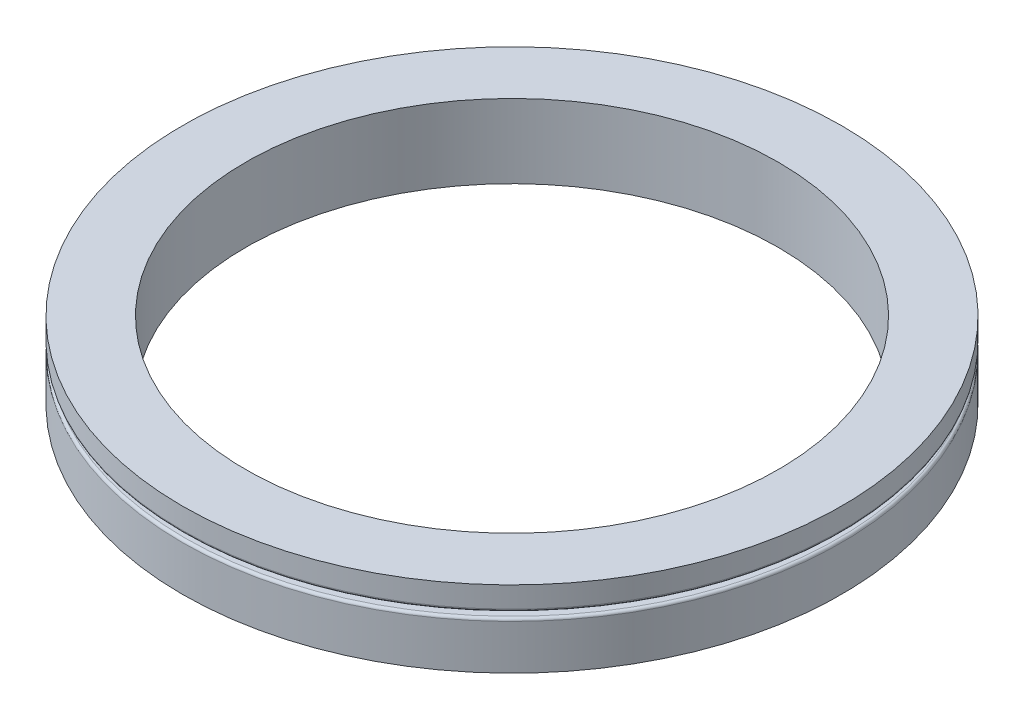
ISO-10303-21;
HEADER;
FILE_DESCRIPTION(('STEP AP214'),'2;1');
FILE_NAME('part.step','',(''),(''),'','','');
FILE_SCHEMA(('AUTOMOTIVE_DESIGN { 1 0 10303 214 1 1 1 1 }'));
ENDSEC;
DATA;
#1=APPLICATION_CONTEXT('core data for automotive mechanical design processes');
#2=APPLICATION_PROTOCOL_DEFINITION('international standard','automotive_design',2000,#1);
#3=PRODUCT_CONTEXT('',#1,'mechanical');
#4=PRODUCT('Part','Part','',(#3));
#5=PRODUCT_RELATED_PRODUCT_CATEGORY('part','',(#4));
#6=PRODUCT_DEFINITION_FORMATION('','',#4);
#7=PRODUCT_DEFINITION_CONTEXT('part definition',#1,'design');
#8=PRODUCT_DEFINITION('design','',#6,#7);
#9=PRODUCT_DEFINITION_SHAPE('','',#8);
#10=(LENGTH_UNIT() NAMED_UNIT(*) SI_UNIT(.MILLI.,.METRE.));
#11=(NAMED_UNIT(*) PLANE_ANGLE_UNIT() SI_UNIT($,.RADIAN.));
#12=(NAMED_UNIT(*) SI_UNIT($,.STERADIAN.) SOLID_ANGLE_UNIT());
#13=UNCERTAINTY_MEASURE_WITH_UNIT(LENGTH_MEASURE(1.E-05),#10,'distance_accuracy_value','');
#14=(GEOMETRIC_REPRESENTATION_CONTEXT(3) GLOBAL_UNCERTAINTY_ASSIGNED_CONTEXT((#13)) GLOBAL_UNIT_ASSIGNED_CONTEXT((#10,
#11,#12)) REPRESENTATION_CONTEXT('',''));
#15=CARTESIAN_POINT('',(0.,0.,0.));
#16=DIRECTION('',(0.,0.,1.));
#17=DIRECTION('',(1.,0.,0.));
#18=AXIS2_PLACEMENT_3D('',#15,#16,#17);
#19=CARTESIAN_POINT('',(0.,-7.94999999999861,0.));
#20=DIRECTION('',(0.,-1.,0.));
#21=DIRECTION('',(0.,0.,-1.));
#22=AXIS2_PLACEMENT_3D('',#19,#20,#21);
#23=TOROIDAL_SURFACE('',#22,124.,1.);
#24=CARTESIAN_POINT('',(0.,-7.9499999999986,0.));
#25=DIRECTION('',(0.,-1.,0.));
#26=DIRECTION('',(0.,0.,-1.));
#27=AXIS2_PLACEMENT_3D('',#24,#25,#26);
#28=CIRCLE('',#27,125.);
#29=CARTESIAN_POINT('',(0.,-7.9499999999986,-125.));
#30=VERTEX_POINT('',#29);
#31=EDGE_CURVE('E80',#30,#30,#28,.T.);
#32=ORIENTED_EDGE('',*,*,#31,.T.);
#33=EDGE_LOOP('',(#32));
#34=FACE_BOUND('',#33,.T.);
#35=CARTESIAN_POINT('',(0.,-8.94999999999861,0.));
#36=DIRECTION('',(0.,-1.,0.));
#37=DIRECTION('',(0.,0.,-1.));
#38=AXIS2_PLACEMENT_3D('',#35,#36,#37);
#39=CIRCLE('',#38,123.999999999999);
#40=CARTESIAN_POINT('',(0.,-8.94999999999861,-123.999999999999));
#41=VERTEX_POINT('',#40);
#42=EDGE_CURVE('E11',#41,#41,#39,.T.);
#43=ORIENTED_EDGE('',*,*,#42,.F.);
#44=EDGE_LOOP('',(#43));
#45=FACE_BOUND('',#44,.T.);
#46=ADVANCED_FACE('F52',(#34,#45),#23,.T.);
#47=CARTESIAN_POINT('',(-1.58044037758986E-12,-8.9499999999993,0.));
#48=DIRECTION('',(0.,1.,0.));
#49=DIRECTION('',(0.,0.,1.));
#50=AXIS2_PLACEMENT_3D('',#47,#48,#49);
#51=PLANE('',#50);
#52=CARTESIAN_POINT('',(0.,-8.94999999999999,0.));
#53=DIRECTION('',(0.,-1.,0.));
#54=DIRECTION('',(0.,0.,-1.));
#55=AXIS2_PLACEMENT_3D('',#52,#53,#54);
#56=CIRCLE('',#55,116.150862197135);
#57=CARTESIAN_POINT('',(0.,-8.94999999999999,-116.150862197135));
#58=VERTEX_POINT('',#57);
#59=EDGE_CURVE('E58',#58,#58,#56,.T.);
#60=ORIENTED_EDGE('',*,*,#59,.F.);
#61=EDGE_LOOP('',(#60));
#62=FACE_BOUND('',#61,.T.);
#63=ORIENTED_EDGE('',*,*,#42,.T.);
#64=EDGE_LOOP('',(#63));
#65=FACE_BOUND('',#64,.T.);
#66=ADVANCED_FACE('F125',(#62,#65),#51,.F.);
#67=CARTESIAN_POINT('',(0.,-8.94999999999999,0.));
#68=DIRECTION('',(0.,1.,0.));
#69=DIRECTION('',(0.,0.,1.));
#70=AXIS2_PLACEMENT_3D('',#67,#68,#69);
#71=CONICAL_SURFACE('',#70,116.150862197135,0.785398163400437);
#72=CARTESIAN_POINT('',(0.,-10.9999999999877,0.));
#73=DIRECTION('',(0.,-1.,0.));
#74=DIRECTION('',(0.,0.,-1.));
#75=AXIS2_PLACEMENT_3D('',#72,#73,#74);
#76=CIRCLE('',#75,114.100862197135);
#77=CARTESIAN_POINT('',(0.,-10.9999999999877,-114.100862197135));
#78=VERTEX_POINT('',#77);
#79=EDGE_CURVE('E62',#78,#78,#76,.T.);
#80=ORIENTED_EDGE('',*,*,#79,.F.);
#81=EDGE_LOOP('',(#80));
#82=FACE_BOUND('',#81,.T.);
#83=ORIENTED_EDGE('',*,*,#59,.T.);
#84=EDGE_LOOP('',(#83));
#85=FACE_BOUND('',#84,.T.);
#86=ADVANCED_FACE('F130',(#82,#85),#71,.T.);
#87=CARTESIAN_POINT('',(0.,-10.9999999999877,0.));
#88=DIRECTION('',(0.,1.,0.));
#89=DIRECTION('',(0.,0.,1.));
#90=AXIS2_PLACEMENT_3D('',#87,#88,#89);
#91=PLANE('',#90);
#92=CARTESIAN_POINT('',(0.,-10.9999999999877,0.));
#93=DIRECTION('',(0.,-1.,0.));
#94=DIRECTION('',(0.,0.,-1.));
#95=AXIS2_PLACEMENT_3D('',#92,#93,#94);
#96=CIRCLE('',#95,110.95);
#97=CARTESIAN_POINT('',(0.,-10.9999999999877,-110.95));
#98=VERTEX_POINT('',#97);
#99=EDGE_CURVE('E66',#98,#98,#96,.T.);
#100=ORIENTED_EDGE('',*,*,#99,.F.);
#101=EDGE_LOOP('',(#100));
#102=FACE_BOUND('',#101,.T.);
#103=ORIENTED_EDGE('',*,*,#79,.T.);
#104=EDGE_LOOP('',(#103));
#105=FACE_BOUND('',#104,.T.);
#106=ADVANCED_FACE('F121',(#102,#105),#91,.F.);
#107=CARTESIAN_POINT('',(0.,-11.9999999999878,0.));
#108=DIRECTION('',(0.,-1.,0.));
#109=DIRECTION('',(0.,0.,-1.));
#110=AXIS2_PLACEMENT_3D('',#107,#108,#109);
#111=TOROIDAL_SURFACE('',#110,110.95,1.);
#112=ORIENTED_EDGE('',*,*,#99,.T.);
#113=EDGE_LOOP('',(#112));
#114=FACE_BOUND('',#113,.T.);
#115=CARTESIAN_POINT('',(0.,-11.9999999999878,0.));
#116=DIRECTION('',(0.,-1.,0.));
#117=DIRECTION('',(0.,0.,-1.));
#118=AXIS2_PLACEMENT_3D('',#115,#116,#117);
#119=CIRCLE('',#118,109.95);
#120=CARTESIAN_POINT('',(0.,-11.9999999999878,-109.95));
#121=VERTEX_POINT('',#120);
#122=EDGE_CURVE('E71',#121,#121,#119,.T.);
#123=ORIENTED_EDGE('',*,*,#122,.F.);
#124=EDGE_LOOP('',(#123));
#125=FACE_BOUND('',#124,.T.);
#126=ADVANCED_FACE('F111',(#114,#125),#111,.F.);
#127=CARTESIAN_POINT('',(0.,0.,0.));
#128=DIRECTION('',(0.,-1.,0.));
#129=DIRECTION('',(0.,0.,-1.));
#130=AXIS2_PLACEMENT_3D('',#127,#128,#129);
#131=CYLINDRICAL_SURFACE('',#130,109.95);
#132=ORIENTED_EDGE('',*,*,#122,.T.);
#133=EDGE_LOOP('',(#132));
#134=FACE_BOUND('',#133,.T.);
#135=CARTESIAN_POINT('',(0.,-21.8491378028649,0.));
#136=DIRECTION('',(0.,-1.,0.));
#137=DIRECTION('',(0.,0.,-1.));
#138=AXIS2_PLACEMENT_3D('',#135,#136,#137);
#139=CIRCLE('',#138,109.95);
#140=CARTESIAN_POINT('',(0.,-21.8491378028649,-109.95));
#141=VERTEX_POINT('',#140);
#142=EDGE_CURVE('E92',#141,#141,#139,.T.);
#143=ORIENTED_EDGE('',*,*,#142,.F.);
#144=EDGE_LOOP('',(#143));
#145=FACE_BOUND('',#144,.T.);
#146=ADVANCED_FACE('F108',(#134,#145),#131,.T.);
#147=CARTESIAN_POINT('',(0.,0.,0.));
#148=DIRECTION('',(0.,-1.,0.));
#149=DIRECTION('',(0.,0.,-1.));
#150=AXIS2_PLACEMENT_3D('',#147,#148,#149);
#151=CYLINDRICAL_SURFACE('',#150,101.);
#152=CARTESIAN_POINT('',(0.,0.,0.));
#153=DIRECTION('',(0.,-1.,0.));
#154=DIRECTION('',(0.,0.,-1.));
#155=AXIS2_PLACEMENT_3D('',#152,#153,#154);
#156=CIRCLE('',#155,101.);
#157=CARTESIAN_POINT('',(0.,0.,-101.));
#158=VERTEX_POINT('',#157);
#159=EDGE_CURVE('E74',#158,#158,#156,.T.);
#160=ORIENTED_EDGE('',*,*,#159,.F.);
#161=EDGE_LOOP('',(#160));
#162=FACE_BOUND('',#161,.T.);
#163=CARTESIAN_POINT('',(0.,-27.9999999999878,0.));
#164=DIRECTION('',(0.,-1.,0.));
#165=DIRECTION('',(0.,0.,-1.));
#166=AXIS2_PLACEMENT_3D('',#163,#164,#165);
#167=CIRCLE('',#166,101.);
#168=CARTESIAN_POINT('',(0.,-27.9999999999878,-101.));
#169=VERTEX_POINT('',#168);
#170=EDGE_CURVE('E89',#169,#169,#167,.T.);
#171=ORIENTED_EDGE('',*,*,#170,.T.);
#172=EDGE_LOOP('',(#171));
#173=FACE_BOUND('',#172,.T.);
#174=ADVANCED_FACE('F110',(#162,#173),#151,.F.);
#175=CARTESIAN_POINT('',(0.,0.,0.));
#176=DIRECTION('',(0.,1.,0.));
#177=DIRECTION('',(0.,0.,1.));
#178=AXIS2_PLACEMENT_3D('',#175,#176,#177);
#179=PLANE('',#178);
#180=ORIENTED_EDGE('',*,*,#159,.T.);
#181=EDGE_LOOP('',(#180));
#182=FACE_BOUND('',#181,.T.);
#183=CARTESIAN_POINT('',(0.,0.,0.));
#184=DIRECTION('',(0.,-1.,0.));
#185=DIRECTION('',(0.,0.,-1.));
#186=AXIS2_PLACEMENT_3D('',#183,#184,#185);
#187=CIRCLE('',#186,125.);
#188=CARTESIAN_POINT('',(0.,0.,-125.));
#189=VERTEX_POINT('',#188);
#190=EDGE_CURVE('E77',#189,#189,#187,.T.);
#191=ORIENTED_EDGE('',*,*,#190,.F.);
#192=EDGE_LOOP('',(#191));
#193=FACE_BOUND('',#192,.T.);
#194=ADVANCED_FACE('F118',(#182,#193),#179,.T.);
#195=CARTESIAN_POINT('',(0.,0.,0.));
#196=DIRECTION('',(0.,-1.,0.));
#197=DIRECTION('',(0.,0.,-1.));
#198=AXIS2_PLACEMENT_3D('',#195,#196,#197);
#199=CYLINDRICAL_SURFACE('',#198,125.);
#200=ORIENTED_EDGE('',*,*,#190,.T.);
#201=EDGE_LOOP('',(#200));
#202=FACE_BOUND('',#201,.T.);
#203=ORIENTED_EDGE('',*,*,#31,.F.);
#204=EDGE_LOOP('',(#203));
#205=FACE_BOUND('',#204,.T.);
#206=ADVANCED_FACE('F135',(#202,#205),#199,.T.);
#207=CARTESIAN_POINT('',(0.,0.,0.));
#208=DIRECTION('',(0.,-1.,0.));
#209=DIRECTION('',(0.,0.,-1.));
#210=AXIS2_PLACEMENT_3D('',#207,#208,#209);
#211=CYLINDRICAL_SURFACE('',#210,112.);
#212=CARTESIAN_POINT('',(0.,-26.9999999999877,0.));
#213=DIRECTION('',(0.,-1.,0.));
#214=DIRECTION('',(0.,0.,-1.));
#215=AXIS2_PLACEMENT_3D('',#212,#213,#214);
#216=CIRCLE('',#215,112.);
#217=CARTESIAN_POINT('',(0.,-26.9999999999877,-112.));
#218=VERTEX_POINT('',#217);
#219=EDGE_CURVE('E83',#218,#218,#216,.T.);
#220=ORIENTED_EDGE('',*,*,#219,.F.);
#221=EDGE_LOOP('',(#220));
#222=FACE_BOUND('',#221,.T.);
#223=CARTESIAN_POINT('',(0.,-23.8991378028648,0.));
#224=DIRECTION('',(0.,-1.,0.));
#225=DIRECTION('',(0.,0.,-1.));
#226=AXIS2_PLACEMENT_3D('',#223,#224,#225);
#227=CIRCLE('',#226,112.);
#228=CARTESIAN_POINT('',(0.,-23.8991378028648,-112.));
#229=VERTEX_POINT('',#228);
#230=EDGE_CURVE('E95',#229,#229,#227,.T.);
#231=ORIENTED_EDGE('',*,*,#230,.T.);
#232=EDGE_LOOP('',(#231));
#233=FACE_BOUND('',#232,.T.);
#234=ADVANCED_FACE('F99',(#222,#233),#211,.T.);
#235=CARTESIAN_POINT('',(0.,-26.9999999999878,0.));
#236=DIRECTION('',(0.,-1.,0.));
#237=DIRECTION('',(0.,0.,-1.));
#238=AXIS2_PLACEMENT_3D('',#235,#236,#237);
#239=TOROIDAL_SURFACE('',#238,111.,1.);
#240=CARTESIAN_POINT('',(0.,-27.9999999999878,0.));
#241=DIRECTION('',(0.,-1.,0.));
#242=DIRECTION('',(0.,0.,-1.));
#243=AXIS2_PLACEMENT_3D('',#240,#241,#242);
#244=CIRCLE('',#243,111.);
#245=CARTESIAN_POINT('',(0.,-27.9999999999878,-111.));
#246=VERTEX_POINT('',#245);
#247=EDGE_CURVE('E86',#246,#246,#244,.T.);
#248=ORIENTED_EDGE('',*,*,#247,.F.);
#249=EDGE_LOOP('',(#248));
#250=FACE_BOUND('',#249,.T.);
#251=ORIENTED_EDGE('',*,*,#219,.T.);
#252=EDGE_LOOP('',(#251));
#253=FACE_BOUND('',#252,.T.);
#254=ADVANCED_FACE('F143',(#250,#253),#239,.T.);
#255=CARTESIAN_POINT('',(0.,-27.9999999999878,0.));
#256=DIRECTION('',(0.,1.,0.));
#257=DIRECTION('',(0.,0.,1.));
#258=AXIS2_PLACEMENT_3D('',#255,#256,#257);
#259=PLANE('',#258);
#260=ORIENTED_EDGE('',*,*,#170,.F.);
#261=EDGE_LOOP('',(#260));
#262=FACE_BOUND('',#261,.T.);
#263=ORIENTED_EDGE('',*,*,#247,.T.);
#264=EDGE_LOOP('',(#263));
#265=FACE_BOUND('',#264,.T.);
#266=ADVANCED_FACE('F104',(#262,#265),#259,.F.);
#267=CARTESIAN_POINT('',(0.,-21.8491378028649,0.));
#268=DIRECTION('',(0.,-1.,0.));
#269=DIRECTION('',(0.,0.,-1.));
#270=AXIS2_PLACEMENT_3D('',#267,#268,#269);
#271=CONICAL_SURFACE('',#270,109.95,0.785398163397452);
#272=ORIENTED_EDGE('',*,*,#230,.F.);
#273=EDGE_LOOP('',(#272));
#274=FACE_BOUND('',#273,.T.);
#275=ORIENTED_EDGE('',*,*,#142,.T.);
#276=EDGE_LOOP('',(#275));
#277=FACE_BOUND('',#276,.T.);
#278=ADVANCED_FACE('F101',(#274,#277),#271,.T.);
#279=CLOSED_SHELL('',(#46,#66,#86,#106,#126,#146,#174,#194,#206,#234,#254,#266,#278));
#280=MANIFOLD_SOLID_BREP('B2_NOT_SHOWN',#279);
#281=CARTESIAN_POINT('',(0.,-23.7748737341529,0.));
#282=DIRECTION('',(0.,-1.,0.));
#283=DIRECTION('',(0.,0.,-1.));
#284=AXIS2_PLACEMENT_3D('',#281,#282,#283);
#285=CONICAL_SURFACE('',#284,112.3,0.785398163397452);
#286=CARTESIAN_POINT('',(0.,-22.2374368670765,0.));
#287=DIRECTION('',(0.,-1.,0.));
#288=DIRECTION('',(0.,0.,-1.));
#289=AXIS2_PLACEMENT_3D('',#286,#287,#288);
#290=CIRCLE('',#289,110.762563132924);
#291=CARTESIAN_POINT('',(0.,-22.2374368670765,-110.762563132924));
#292=VERTEX_POINT('',#291);
#293=EDGE_CURVE('E51',#292,#292,#290,.T.);
#294=ORIENTED_EDGE('',*,*,#293,.F.);
#295=EDGE_LOOP('',(#294));
#296=FACE_BOUND('',#295,.T.);
#297=CARTESIAN_POINT('',(0.,-23.7748737341529,0.));
#298=DIRECTION('',(0.,-1.,0.));
#299=DIRECTION('',(0.,0.,-1.));
#300=AXIS2_PLACEMENT_3D('',#297,#298,#299);
#301=CIRCLE('',#300,112.3);
#302=CARTESIAN_POINT('',(0.,-23.7748737341529,-112.3));
#303=VERTEX_POINT('',#302);
#304=EDGE_CURVE('E311',#303,#303,#301,.T.);
#305=ORIENTED_EDGE('',*,*,#304,.T.);
#306=EDGE_LOOP('',(#305));
#307=FACE_BOUND('',#306,.T.);
#308=ADVANCED_FACE('F292',(#296,#307),#285,.F.);
#309=CARTESIAN_POINT('',(0.,-20.9999999999913,0.));
#310=DIRECTION('',(0.,-1.,0.));
#311=DIRECTION('',(0.,0.,-1.));
#312=AXIS2_PLACEMENT_3D('',#309,#310,#311);
#313=TOROIDAL_SURFACE('',#312,111.999999999996,1.7500000000036);
#314=CARTESIAN_POINT('',(0.,-20.9999999999878,0.));
#315=DIRECTION('',(0.,-1.,0.));
#316=DIRECTION('',(0.,0.,-1.));
#317=AXIS2_PLACEMENT_3D('',#314,#315,#316);
#318=CIRCLE('',#317,113.75);
#319=CARTESIAN_POINT('',(0.,-20.9999999999878,-113.75));
#320=VERTEX_POINT('',#319);
#321=EDGE_CURVE('E298',#320,#320,#318,.T.);
#322=ORIENTED_EDGE('',*,*,#321,.F.);
#323=EDGE_LOOP('',(#322));
#324=FACE_BOUND('',#323,.T.);
#325=ORIENTED_EDGE('',*,*,#293,.T.);
#326=EDGE_LOOP('',(#325));
#327=FACE_BOUND('',#326,.T.);
#328=ADVANCED_FACE('F330',(#324,#327),#313,.T.);
#329=CARTESIAN_POINT('',(0.,0.,0.));
#330=DIRECTION('',(0.,-1.,0.));
#331=DIRECTION('',(0.,0.,-1.));
#332=AXIS2_PLACEMENT_3D('',#329,#330,#331);
#333=CYLINDRICAL_SURFACE('',#332,113.75);
#334=ORIENTED_EDGE('',*,*,#321,.T.);
#335=EDGE_LOOP('',(#334));
#336=FACE_BOUND('',#335,.T.);
#337=CARTESIAN_POINT('',(0.,-25.7748737341529,0.));
#338=DIRECTION('',(0.,-1.,0.));
#339=DIRECTION('',(0.,0.,-1.));
#340=AXIS2_PLACEMENT_3D('',#337,#338,#339);
#341=CIRCLE('',#340,113.75);
#342=CARTESIAN_POINT('',(0.,-25.7748737341529,-113.75));
#343=VERTEX_POINT('',#342);
#344=EDGE_CURVE('E302',#343,#343,#341,.T.);
#345=ORIENTED_EDGE('',*,*,#344,.F.);
#346=EDGE_LOOP('',(#345));
#347=FACE_BOUND('',#346,.T.);
#348=ADVANCED_FACE('F324',(#336,#347),#333,.T.);
#349=CARTESIAN_POINT('',(0.,-25.7748737341529,0.));
#350=DIRECTION('',(0.,-1.,0.));
#351=DIRECTION('',(0.,0.,-1.));
#352=AXIS2_PLACEMENT_3D('',#349,#350,#351);
#353=PLANE('',#352);
#354=ORIENTED_EDGE('',*,*,#344,.T.);
#355=EDGE_LOOP('',(#354));
#356=FACE_BOUND('',#355,.T.);
#357=CARTESIAN_POINT('',(0.,-25.7748737341529,0.));
#358=DIRECTION('',(0.,-1.,0.));
#359=DIRECTION('',(0.,0.,-1.));
#360=AXIS2_PLACEMENT_3D('',#357,#358,#359);
#361=CIRCLE('',#360,112.3);
#362=CARTESIAN_POINT('',(0.,-25.7748737341529,-112.3));
#363=VERTEX_POINT('',#362);
#364=EDGE_CURVE('E306',#363,#363,#361,.T.);
#365=ORIENTED_EDGE('',*,*,#364,.F.);
#366=EDGE_LOOP('',(#365));
#367=FACE_BOUND('',#366,.T.);
#368=ADVANCED_FACE('F319',(#356,#367),#353,.T.);
#369=CARTESIAN_POINT('',(0.,0.,0.));
#370=DIRECTION('',(0.,-1.,0.));
#371=DIRECTION('',(0.,0.,-1.));
#372=AXIS2_PLACEMENT_3D('',#369,#370,#371);
#373=CYLINDRICAL_SURFACE('',#372,112.3);
#374=ORIENTED_EDGE('',*,*,#304,.F.);
#375=EDGE_LOOP('',(#374));
#376=FACE_BOUND('',#375,.T.);
#377=ORIENTED_EDGE('',*,*,#364,.T.);
#378=EDGE_LOOP('',(#377));
#379=FACE_BOUND('',#378,.T.);
#380=ADVANCED_FACE('F316',(#376,#379),#373,.F.);
#381=CLOSED_SHELL('',(#308,#328,#348,#368,#380));
#382=MANIFOLD_SOLID_BREP('B6',#381);
#383=CARTESIAN_POINT('',(0.,-10.9999999999877,0.));
#384=DIRECTION('',(0.,-1.,0.));
#385=DIRECTION('',(0.,0.,-1.));
#386=AXIS2_PLACEMENT_3D('',#383,#384,#385);
#387=TOROIDAL_SURFACE('',#386,117.,1.75000000000433);
#388=CARTESIAN_POINT('',(0.,-12.2374368670765,0.));
#389=DIRECTION('',(0.,-1.,0.));
#390=DIRECTION('',(0.,0.,-1.));
#391=AXIS2_PLACEMENT_3D('',#388,#389,#390);
#392=CIRCLE('',#391,118.237436867076);
#393=CARTESIAN_POINT('',(0.,-12.2374368670765,-118.237436867076));
#394=VERTEX_POINT('',#393);
#395=EDGE_CURVE('E405',#394,#394,#392,.T.);
#396=ORIENTED_EDGE('',*,*,#395,.T.);
#397=EDGE_LOOP('',(#396));
#398=FACE_BOUND('',#397,.T.);
#399=CARTESIAN_POINT('',(0.,-9.24999999998774,0.));
#400=DIRECTION('',(0.,-1.,0.));
#401=DIRECTION('',(0.,0.,-1.));
#402=AXIS2_PLACEMENT_3D('',#399,#400,#401);
#403=CIRCLE('',#402,117.);
#404=CARTESIAN_POINT('',(0.,-9.24999999998774,-117.));
#405=VERTEX_POINT('',#404);
#406=EDGE_CURVE('E291',#405,#405,#403,.T.);
#407=ORIENTED_EDGE('',*,*,#406,.F.);
#408=EDGE_LOOP('',(#407));
#409=FACE_BOUND('',#408,.T.);
#410=ADVANCED_FACE('F386',(#398,#409),#387,.T.);
#411=CARTESIAN_POINT('',(2.37288290948056E-11,-9.24999999999387,0.));
#412=DIRECTION('',(0.,1.,0.));
#413=DIRECTION('',(0.,0.,1.));
#414=AXIS2_PLACEMENT_3D('',#411,#412,#413);
#415=PLANE('',#414);
#416=ORIENTED_EDGE('',*,*,#406,.T.);
#417=EDGE_LOOP('',(#416));
#418=FACE_BOUND('',#417,.T.);
#419=CARTESIAN_POINT('',(0.,-9.24999999999999,0.));
#420=DIRECTION('',(0.,-1.,0.));
#421=DIRECTION('',(0.,0.,-1.));
#422=AXIS2_PLACEMENT_3D('',#419,#420,#421);
#423=CIRCLE('',#422,121.774873734153);
#424=CARTESIAN_POINT('',(0.,-9.24999999999999,-121.774873734153));
#425=VERTEX_POINT('',#424);
#426=EDGE_CURVE('E392',#425,#425,#423,.T.);
#427=ORIENTED_EDGE('',*,*,#426,.F.);
#428=EDGE_LOOP('',(#427));
#429=FACE_BOUND('',#428,.T.);
#430=ADVANCED_FACE('F425',(#418,#429),#415,.T.);
#431=CARTESIAN_POINT('',(0.,0.,0.));
#432=DIRECTION('',(0.,-1.,0.));
#433=DIRECTION('',(0.,0.,-1.));
#434=AXIS2_PLACEMENT_3D('',#431,#432,#433);
#435=CYLINDRICAL_SURFACE('',#434,121.774873734153);
#436=ORIENTED_EDGE('',*,*,#426,.T.);
#437=EDGE_LOOP('',(#436));
#438=FACE_BOUND('',#437,.T.);
#439=CARTESIAN_POINT('',(0.,-10.7,0.));
#440=DIRECTION('',(0.,-1.,0.));
#441=DIRECTION('',(0.,0.,-1.));
#442=AXIS2_PLACEMENT_3D('',#439,#440,#441);
#443=CIRCLE('',#442,121.774873734153);
#444=CARTESIAN_POINT('',(0.,-10.7,-121.774873734153));
#445=VERTEX_POINT('',#444);
#446=EDGE_CURVE('E396',#445,#445,#443,.T.);
#447=ORIENTED_EDGE('',*,*,#446,.F.);
#448=EDGE_LOOP('',(#447));
#449=FACE_BOUND('',#448,.T.);
#450=ADVANCED_FACE('F420',(#438,#449),#435,.T.);
#451=CARTESIAN_POINT('',(6.55315211771488E-11,-10.6999999999939,0.));
#452=DIRECTION('',(0.,1.,0.));
#453=DIRECTION('',(0.,0.,1.));
#454=AXIS2_PLACEMENT_3D('',#451,#452,#453);
#455=PLANE('',#454);
#456=CARTESIAN_POINT('',(0.,-10.6999999999878,0.));
#457=DIRECTION('',(0.,-1.,0.));
#458=DIRECTION('',(0.,0.,-1.));
#459=AXIS2_PLACEMENT_3D('',#456,#457,#458);
#460=CIRCLE('',#459,119.774873734153);
#461=CARTESIAN_POINT('',(0.,-10.6999999999878,-119.774873734153));
#462=VERTEX_POINT('',#461);
#463=EDGE_CURVE('E400',#462,#462,#460,.T.);
#464=ORIENTED_EDGE('',*,*,#463,.F.);
#465=EDGE_LOOP('',(#464));
#466=FACE_BOUND('',#465,.T.);
#467=ORIENTED_EDGE('',*,*,#446,.T.);
#468=EDGE_LOOP('',(#467));
#469=FACE_BOUND('',#468,.T.);
#470=ADVANCED_FACE('F414',(#466,#469),#455,.F.);
#471=CARTESIAN_POINT('',(0.,-10.6999999999878,0.));
#472=DIRECTION('',(0.,1.,0.));
#473=DIRECTION('',(0.,0.,1.));
#474=AXIS2_PLACEMENT_3D('',#471,#472,#473);
#475=CONICAL_SURFACE('',#474,119.774873734153,0.785398163393482);
#476=ORIENTED_EDGE('',*,*,#395,.F.);
#477=EDGE_LOOP('',(#476));
#478=FACE_BOUND('',#477,.T.);
#479=ORIENTED_EDGE('',*,*,#463,.T.);
#480=EDGE_LOOP('',(#479));
#481=FACE_BOUND('',#480,.T.);
#482=ADVANCED_FACE('F411',(#478,#481),#475,.T.);
#483=CLOSED_SHELL('',(#410,#430,#450,#470,#482));
#484=MANIFOLD_SOLID_BREP('B46',#483);
#485=CARTESIAN_POINT('',(0.,-10.9999999999939,0.));
#486=DIRECTION('',(0.,-1.,0.));
#487=DIRECTION('',(0.,0.,-1.));
#488=AXIS2_PLACEMENT_3D('',#485,#486,#487);
#489=PLANE('',#488);
#490=CARTESIAN_POINT('',(0.,-10.9999999999878,0.));
#491=DIRECTION('',(0.,-1.,0.));
#492=DIRECTION('',(0.,0.,-1.));
#493=AXIS2_PLACEMENT_3D('',#490,#491,#492);
#494=CIRCLE('',#493,124.);
#495=CARTESIAN_POINT('',(0.,-10.9999999999878,-124.));
#496=VERTEX_POINT('',#495);
#497=EDGE_CURVE('E385',#496,#496,#494,.T.);
#498=ORIENTED_EDGE('',*,*,#497,.F.);
#499=EDGE_LOOP('',(#498));
#500=FACE_BOUND('',#499,.T.);
#501=CARTESIAN_POINT('',(0.,-11.,0.));
#502=DIRECTION('',(0.,-1.,0.));
#503=DIRECTION('',(0.,0.,-1.));
#504=AXIS2_PLACEMENT_3D('',#501,#502,#503);
#505=CIRCLE('',#504,119.899137802865);
#506=CARTESIAN_POINT('',(0.,-11.,-119.899137802865));
#507=VERTEX_POINT('',#506);
#508=EDGE_CURVE('E507',#507,#507,#505,.T.);
#509=ORIENTED_EDGE('',*,*,#508,.T.);
#510=EDGE_LOOP('',(#509));
#511=FACE_BOUND('',#510,.T.);
#512=ADVANCED_FACE('F473',(#500,#511),#489,.F.);
#513=CARTESIAN_POINT('',(0.,-11.9999999999878,0.));
#514=DIRECTION('',(0.,-1.,0.));
#515=DIRECTION('',(0.,0.,-1.));
#516=AXIS2_PLACEMENT_3D('',#513,#514,#515);
#517=TOROIDAL_SURFACE('',#516,124.,1.);
#518=CARTESIAN_POINT('',(0.,-11.9999999999878,0.));
#519=DIRECTION('',(0.,-1.,0.));
#520=DIRECTION('',(0.,0.,-1.));
#521=AXIS2_PLACEMENT_3D('',#518,#519,#520);
#522=CIRCLE('',#521,125.);
#523=CARTESIAN_POINT('',(0.,-11.9999999999878,-125.));
#524=VERTEX_POINT('',#523);
#525=EDGE_CURVE('E479',#524,#524,#522,.T.);
#526=ORIENTED_EDGE('',*,*,#525,.F.);
#527=EDGE_LOOP('',(#526));
#528=FACE_BOUND('',#527,.T.);
#529=ORIENTED_EDGE('',*,*,#497,.T.);
#530=EDGE_LOOP('',(#529));
#531=FACE_BOUND('',#530,.T.);
#532=ADVANCED_FACE('F530',(#528,#531),#517,.T.);
#533=CARTESIAN_POINT('',(0.,0.,0.));
#534=DIRECTION('',(0.,-1.,0.));
#535=DIRECTION('',(0.,0.,-1.));
#536=AXIS2_PLACEMENT_3D('',#533,#534,#535);
#537=CYLINDRICAL_SURFACE('',#536,125.);
#538=CARTESIAN_POINT('',(0.,-28.9999999999878,0.));
#539=DIRECTION('',(0.,-1.,0.));
#540=DIRECTION('',(0.,0.,-1.));
#541=AXIS2_PLACEMENT_3D('',#538,#539,#540);
#542=CIRCLE('',#541,125.);
#543=CARTESIAN_POINT('',(0.,-28.9999999999878,-125.));
#544=VERTEX_POINT('',#543);
#545=EDGE_CURVE('E483',#544,#544,#542,.T.);
#546=ORIENTED_EDGE('',*,*,#545,.F.);
#547=EDGE_LOOP('',(#546));
#548=FACE_BOUND('',#547,.T.);
#549=ORIENTED_EDGE('',*,*,#525,.T.);
#550=EDGE_LOOP('',(#549));
#551=FACE_BOUND('',#550,.T.);
#552=ADVANCED_FACE('F535',(#548,#551),#537,.T.);
#553=CARTESIAN_POINT('',(0.,-28.9999999999878,0.));
#554=DIRECTION('',(0.,1.,0.));
#555=DIRECTION('',(0.,0.,1.));
#556=AXIS2_PLACEMENT_3D('',#553,#554,#555);
#557=PLANE('',#556);
#558=CARTESIAN_POINT('',(0.,-28.9999999999878,0.));
#559=DIRECTION('',(0.,-1.,0.));
#560=DIRECTION('',(0.,0.,-1.));
#561=AXIS2_PLACEMENT_3D('',#558,#559,#560);
#562=CIRCLE('',#561,114.05);
#563=CARTESIAN_POINT('',(0.,-28.9999999999878,-114.05));
#564=VERTEX_POINT('',#563);
#565=EDGE_CURVE('E487',#564,#564,#562,.T.);
#566=ORIENTED_EDGE('',*,*,#565,.F.);
#567=EDGE_LOOP('',(#566));
#568=FACE_BOUND('',#567,.T.);
#569=ORIENTED_EDGE('',*,*,#545,.T.);
#570=EDGE_LOOP('',(#569));
#571=FACE_BOUND('',#570,.T.);
#572=ADVANCED_FACE('F540',(#568,#571),#557,.F.);
#573=CARTESIAN_POINT('',(0.,0.,0.));
#574=DIRECTION('',(0.,-1.,0.));
#575=DIRECTION('',(0.,0.,-1.));
#576=AXIS2_PLACEMENT_3D('',#573,#574,#575);
#577=CYLINDRICAL_SURFACE('',#576,114.05);
#578=ORIENTED_EDGE('',*,*,#565,.T.);
#579=EDGE_LOOP('',(#578));
#580=FACE_BOUND('',#579,.T.);
#581=CARTESIAN_POINT('',(0.,-20.1508621971352,0.));
#582=DIRECTION('',(0.,-1.,0.));
#583=DIRECTION('',(0.,0.,-1.));
#584=AXIS2_PLACEMENT_3D('',#581,#582,#583);
#585=CIRCLE('',#584,114.05);
#586=CARTESIAN_POINT('',(0.,-20.1508621971352,-114.05));
#587=VERTEX_POINT('',#586);
#588=EDGE_CURVE('E492',#587,#587,#585,.T.);
#589=ORIENTED_EDGE('',*,*,#588,.F.);
#590=EDGE_LOOP('',(#589));
#591=FACE_BOUND('',#590,.T.);
#592=ADVANCED_FACE('F546',(#580,#591),#577,.F.);
#593=CARTESIAN_POINT('',(0.,-18.1008621971352,0.));
#594=DIRECTION('',(0.,-1.,0.));
#595=DIRECTION('',(0.,0.,-1.));
#596=AXIS2_PLACEMENT_3D('',#593,#594,#595);
#597=CONICAL_SURFACE('',#596,112.,0.785398163397449);
#598=ORIENTED_EDGE('',*,*,#588,.T.);
#599=EDGE_LOOP('',(#598));
#600=FACE_BOUND('',#599,.T.);
#601=CARTESIAN_POINT('',(0.,-18.1008621971352,0.));
#602=DIRECTION('',(0.,-1.,0.));
#603=DIRECTION('',(0.,0.,-1.));
#604=AXIS2_PLACEMENT_3D('',#601,#602,#603);
#605=CIRCLE('',#604,112.);
#606=CARTESIAN_POINT('',(0.,-18.1008621971352,-112.));
#607=VERTEX_POINT('',#606);
#608=EDGE_CURVE('E495',#607,#607,#605,.T.);
#609=ORIENTED_EDGE('',*,*,#608,.F.);
#610=EDGE_LOOP('',(#609));
#611=FACE_BOUND('',#610,.T.);
#612=ADVANCED_FACE('F550',(#600,#611),#597,.F.);
#613=CARTESIAN_POINT('',(0.,0.,0.));
#614=DIRECTION('',(0.,-1.,0.));
#615=DIRECTION('',(0.,0.,-1.));
#616=AXIS2_PLACEMENT_3D('',#613,#614,#615);
#617=CYLINDRICAL_SURFACE('',#616,112.);
#618=ORIENTED_EDGE('',*,*,#608,.T.);
#619=EDGE_LOOP('',(#618));
#620=FACE_BOUND('',#619,.T.);
#621=CARTESIAN_POINT('',(0.,-14.0499999999878,0.));
#622=DIRECTION('',(0.,-1.,0.));
#623=DIRECTION('',(0.,0.,-1.));
#624=AXIS2_PLACEMENT_3D('',#621,#622,#623);
#625=CIRCLE('',#624,112.);
#626=CARTESIAN_POINT('',(0.,-14.0499999999878,-112.));
#627=VERTEX_POINT('',#626);
#628=EDGE_CURVE('E498',#627,#627,#625,.T.);
#629=ORIENTED_EDGE('',*,*,#628,.F.);
#630=EDGE_LOOP('',(#629));
#631=FACE_BOUND('',#630,.T.);
#632=ADVANCED_FACE('F526',(#620,#631),#617,.F.);
#633=CARTESIAN_POINT('',(0.,-14.0499999999878,0.));
#634=DIRECTION('',(0.,-1.,0.));
#635=DIRECTION('',(0.,0.,-1.));
#636=AXIS2_PLACEMENT_3D('',#633,#634,#635);
#637=TOROIDAL_SURFACE('',#636,113.,1.);
#638=CARTESIAN_POINT('',(0.,-13.0499999999878,0.));
#639=DIRECTION('',(0.,-1.,0.));
#640=DIRECTION('',(0.,0.,-1.));
#641=AXIS2_PLACEMENT_3D('',#638,#639,#640);
#642=CIRCLE('',#641,113.);
#643=CARTESIAN_POINT('',(0.,-13.0499999999878,-113.));
#644=VERTEX_POINT('',#643);
#645=EDGE_CURVE('E501',#644,#644,#642,.T.);
#646=ORIENTED_EDGE('',*,*,#645,.F.);
#647=EDGE_LOOP('',(#646));
#648=FACE_BOUND('',#647,.T.);
#649=ORIENTED_EDGE('',*,*,#628,.T.);
#650=EDGE_LOOP('',(#649));
#651=FACE_BOUND('',#650,.T.);
#652=ADVANCED_FACE('F520',(#648,#651),#637,.T.);
#653=CARTESIAN_POINT('',(3.29641933573118E-11,-13.0499999999939,0.));
#654=DIRECTION('',(0.,1.,0.));
#655=DIRECTION('',(0.,0.,1.));
#656=AXIS2_PLACEMENT_3D('',#653,#654,#655);
#657=PLANE('',#656);
#658=ORIENTED_EDGE('',*,*,#645,.T.);
#659=EDGE_LOOP('',(#658));
#660=FACE_BOUND('',#659,.T.);
#661=CARTESIAN_POINT('',(0.,-13.05,0.));
#662=DIRECTION('',(0.,-1.,0.));
#663=DIRECTION('',(0.,0.,-1.));
#664=AXIS2_PLACEMENT_3D('',#661,#662,#663);
#665=CIRCLE('',#664,117.849137802865);
#666=CARTESIAN_POINT('',(0.,-13.05,-117.849137802865));
#667=VERTEX_POINT('',#666);
#668=EDGE_CURVE('E504',#667,#667,#665,.T.);
#669=ORIENTED_EDGE('',*,*,#668,.F.);
#670=EDGE_LOOP('',(#669));
#671=FACE_BOUND('',#670,.T.);
#672=ADVANCED_FACE('F515',(#660,#671),#657,.T.);
#673=CARTESIAN_POINT('',(0.,-13.05,0.));
#674=DIRECTION('',(0.,1.,0.));
#675=DIRECTION('',(0.,0.,1.));
#676=AXIS2_PLACEMENT_3D('',#673,#674,#675);
#677=CONICAL_SURFACE('',#676,117.849137802865,0.78539816339745);
#678=ORIENTED_EDGE('',*,*,#508,.F.);
#679=EDGE_LOOP('',(#678));
#680=FACE_BOUND('',#679,.T.);
#681=ORIENTED_EDGE('',*,*,#668,.T.);
#682=EDGE_LOOP('',(#681));
#683=FACE_BOUND('',#682,.T.);
#684=ADVANCED_FACE('F512',(#680,#683),#677,.F.);
#685=CLOSED_SHELL('',(#512,#532,#552,#572,#592,#612,#632,#652,#672,#684));
#686=MANIFOLD_SOLID_BREP('B286_NOT_SHOWN',#685);
#687=ADVANCED_BREP_SHAPE_REPRESENTATION('',(#18,#280,#382,#484,#686),#14);
#688=SHAPE_DEFINITION_REPRESENTATION(#9,#687);
ENDSEC;
END-ISO-10303-21;
